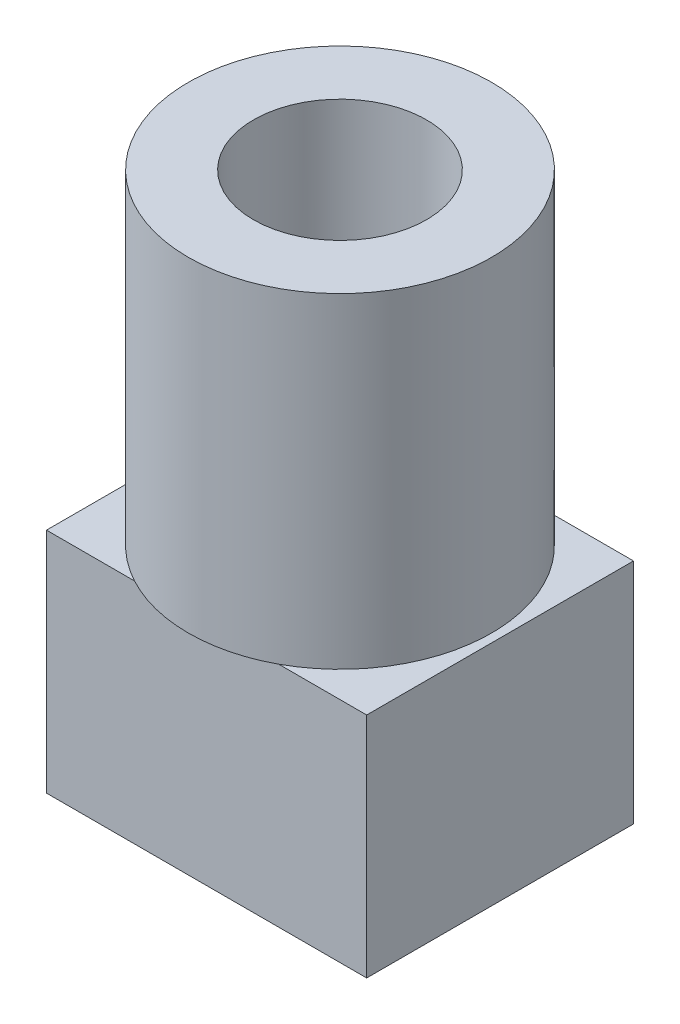
ISO-10303-21;
HEADER;
FILE_DESCRIPTION(('STEP AP214'),'2;1');
FILE_NAME('part.step','',(''),(''),'','','');
FILE_SCHEMA(('AUTOMOTIVE_DESIGN { 1 0 10303 214 1 1 1 1 }'));
ENDSEC;
DATA;
#1=APPLICATION_CONTEXT('core data for automotive mechanical design processes');
#2=APPLICATION_PROTOCOL_DEFINITION('international standard','automotive_design',2000,#1);
#3=PRODUCT_CONTEXT('',#1,'mechanical');
#4=PRODUCT('Part','Part','',(#3));
#5=PRODUCT_RELATED_PRODUCT_CATEGORY('part','',(#4));
#6=PRODUCT_DEFINITION_FORMATION('','',#4);
#7=PRODUCT_DEFINITION_CONTEXT('part definition',#1,'design');
#8=PRODUCT_DEFINITION('design','',#6,#7);
#9=PRODUCT_DEFINITION_SHAPE('','',#8);
#10=(LENGTH_UNIT() NAMED_UNIT(*) SI_UNIT(.MILLI.,.METRE.));
#11=(NAMED_UNIT(*) PLANE_ANGLE_UNIT() SI_UNIT($,.RADIAN.));
#12=(NAMED_UNIT(*) SI_UNIT($,.STERADIAN.) SOLID_ANGLE_UNIT());
#13=UNCERTAINTY_MEASURE_WITH_UNIT(LENGTH_MEASURE(1.E-05),#10,'distance_accuracy_value','');
#14=(GEOMETRIC_REPRESENTATION_CONTEXT(3) GLOBAL_UNCERTAINTY_ASSIGNED_CONTEXT((#13)) GLOBAL_UNIT_ASSIGNED_CONTEXT((#10,
#11,#12)) REPRESENTATION_CONTEXT('',''));
#15=CARTESIAN_POINT('',(0.,0.,0.));
#16=DIRECTION('',(0.,0.,1.));
#17=DIRECTION('',(1.,0.,0.));
#18=AXIS2_PLACEMENT_3D('',#15,#16,#17);
#19=CARTESIAN_POINT('',(4.92,7.,-4.1));
#20=DIRECTION('',(0.,1.,0.));
#21=DIRECTION('',(0.,0.,1.));
#22=AXIS2_PLACEMENT_3D('',#19,#20,#21);
#23=PLANE('',#22);
#24=DIRECTION('',(1.,0.,0.));
#25=VECTOR('',#24,1.);
#26=CARTESIAN_POINT('',(2.,7.,-2.));
#27=LINE('',#26,#25);
#28=CARTESIAN_POINT('',(6.55266653055669,7.,-2.));
#29=VERTEX_POINT('',#28);
#30=CARTESIAN_POINT('',(7.84,7.,-2.));
#31=VERTEX_POINT('',#30);
#32=EDGE_CURVE('E147',#29,#31,#27,.T.);
#33=ORIENTED_EDGE('',*,*,#32,.F.);
#34=CARTESIAN_POINT('',(4.92,7.,-4.1));
#35=DIRECTION('',(0.,1.,0.));
#36=DIRECTION('',(0.,0.,1.));
#37=AXIS2_PLACEMENT_3D('',#34,#35,#36);
#38=CIRCLE('',#37,2.66);
#39=CARTESIAN_POINT('',(6.55266653055669,7.,-6.2));
#40=VERTEX_POINT('',#39);
#41=EDGE_CURVE('E137',#29,#40,#38,.T.);
#42=ORIENTED_EDGE('',*,*,#41,.T.);
#43=DIRECTION('',(-1.,0.,0.));
#44=VECTOR('',#43,1.);
#45=CARTESIAN_POINT('',(2.,7.,-6.2));
#46=LINE('',#45,#44);
#47=CARTESIAN_POINT('',(7.84,7.,-6.2));
#48=VERTEX_POINT('',#47);
#49=EDGE_CURVE('E170',#48,#40,#46,.T.);
#50=ORIENTED_EDGE('',*,*,#49,.F.);
#51=DIRECTION('',(0.,0.,-1.));
#52=VECTOR('',#51,1.);
#53=CARTESIAN_POINT('',(7.84,7.,-6.2));
#54=LINE('',#53,#52);
#55=EDGE_CURVE('E155',#31,#48,#54,.T.);
#56=ORIENTED_EDGE('',*,*,#55,.F.);
#57=EDGE_LOOP('',(#33,#42,#50,#56));
#58=FACE_BOUND('',#57,.T.);
#59=ADVANCED_FACE('F43',(#58),#23,.F.);
#60=CARTESIAN_POINT('',(0.,7.,0.));
#61=DIRECTION('',(0.,-1.,0.));
#62=DIRECTION('',(0.,0.,-1.));
#63=AXIS2_PLACEMENT_3D('',#60,#61,#62);
#64=PLANE('',#63);
#65=CARTESIAN_POINT('',(4.92,7.,-4.1));
#66=DIRECTION('',(0.,1.,0.));
#67=DIRECTION('',(0.,0.,1.));
#68=AXIS2_PLACEMENT_3D('',#65,#66,#67);
#69=CIRCLE('',#68,4.66);
#70=CARTESIAN_POINT('',(7.13485891198514,7.,0.));
#71=VERTEX_POINT('',#70);
#72=CARTESIAN_POINT('',(7.13485891198514,7.,-8.2));
#73=VERTEX_POINT('',#72);
#74=EDGE_CURVE('E52',#71,#73,#69,.T.);
#75=ORIENTED_EDGE('',*,*,#74,.F.);
#76=DIRECTION('',(1.,0.,0.));
#77=VECTOR('',#76,1.);
#78=CARTESIAN_POINT('',(0.,7.,0.));
#79=LINE('',#78,#77);
#80=CARTESIAN_POINT('',(9.84,7.,0.));
#81=VERTEX_POINT('',#80);
#82=EDGE_CURVE('E187',#71,#81,#79,.T.);
#83=ORIENTED_EDGE('',*,*,#82,.T.);
#84=DIRECTION('',(0.,0.,-1.));
#85=VECTOR('',#84,1.);
#86=CARTESIAN_POINT('',(9.84,7.,0.));
#87=LINE('',#86,#85);
#88=CARTESIAN_POINT('',(9.84,7.,-8.2));
#89=VERTEX_POINT('',#88);
#90=EDGE_CURVE('E186',#81,#89,#87,.T.);
#91=ORIENTED_EDGE('',*,*,#90,.T.);
#92=DIRECTION('',(-1.,0.,0.));
#93=VECTOR('',#92,1.);
#94=CARTESIAN_POINT('',(0.,7.,-8.2));
#95=LINE('',#94,#93);
#96=EDGE_CURVE('E195',#89,#73,#95,.T.);
#97=ORIENTED_EDGE('',*,*,#96,.T.);
#98=EDGE_LOOP('',(#75,#83,#91,#97));
#99=FACE_BOUND('',#98,.T.);
#100=ADVANCED_FACE('F237',(#99),#64,.F.);
#101=CARTESIAN_POINT('',(0.,7.,0.));
#102=DIRECTION('',(1.,0.,0.));
#103=DIRECTION('',(0.,0.,-1.));
#104=AXIS2_PLACEMENT_3D('',#101,#102,#103);
#105=PLANE('',#104);
#106=DIRECTION('',(0.,0.,1.));
#107=VECTOR('',#106,1.);
#108=CARTESIAN_POINT('',(0.,0.,0.));
#109=LINE('',#108,#107);
#110=CARTESIAN_POINT('',(0.,0.,-8.2));
#111=VERTEX_POINT('',#110);
#112=CARTESIAN_POINT('',(0.,0.,0.));
#113=VERTEX_POINT('',#112);
#114=EDGE_CURVE('E174',#111,#113,#109,.T.);
#115=ORIENTED_EDGE('',*,*,#114,.T.);
#116=DIRECTION('',(0.,-1.,0.));
#117=VECTOR('',#116,1.);
#118=CARTESIAN_POINT('',(0.,7.,0.));
#119=LINE('',#118,#117);
#120=CARTESIAN_POINT('',(0.,7.,0.));
#121=VERTEX_POINT('',#120);
#122=EDGE_CURVE('E50',#121,#113,#119,.T.);
#123=ORIENTED_EDGE('',*,*,#122,.F.);
#124=DIRECTION('',(0.,0.,1.));
#125=VECTOR('',#124,1.);
#126=CARTESIAN_POINT('',(0.,7.,0.));
#127=LINE('',#126,#125);
#128=CARTESIAN_POINT('',(0.,7.,-8.2));
#129=VERTEX_POINT('',#128);
#130=EDGE_CURVE('E181',#129,#121,#127,.T.);
#131=ORIENTED_EDGE('',*,*,#130,.F.);
#132=DIRECTION('',(0.,-1.,0.));
#133=VECTOR('',#132,1.);
#134=CARTESIAN_POINT('',(0.,7.,-8.2));
#135=LINE('',#134,#133);
#136=EDGE_CURVE('E197',#129,#111,#135,.T.);
#137=ORIENTED_EDGE('',*,*,#136,.T.);
#138=EDGE_LOOP('',(#115,#123,#131,#137));
#139=FACE_BOUND('',#138,.T.);
#140=ADVANCED_FACE('F44',(#139),#105,.F.);
#141=CARTESIAN_POINT('',(0.,7.,0.));
#142=DIRECTION('',(0.,0.,-1.));
#143=DIRECTION('',(-1.,0.,0.));
#144=AXIS2_PLACEMENT_3D('',#141,#142,#143);
#145=PLANE('',#144);
#146=DIRECTION('',(1.,0.,0.));
#147=VECTOR('',#146,1.);
#148=CARTESIAN_POINT('',(0.,0.,0.));
#149=LINE('',#148,#147);
#150=CARTESIAN_POINT('',(9.84,0.,0.));
#151=VERTEX_POINT('',#150);
#152=EDGE_CURVE('E203',#113,#151,#149,.T.);
#153=ORIENTED_EDGE('',*,*,#152,.T.);
#154=DIRECTION('',(0.,-1.,0.));
#155=VECTOR('',#154,1.);
#156=CARTESIAN_POINT('',(9.84,7.,0.));
#157=LINE('',#156,#155);
#158=EDGE_CURVE('E209',#81,#151,#157,.T.);
#159=ORIENTED_EDGE('',*,*,#158,.F.);
#160=ORIENTED_EDGE('',*,*,#82,.F.);
#161=CARTESIAN_POINT('',(2.70514108801486,7.,0.));
#162=VERTEX_POINT('',#161);
#163=EDGE_CURVE('E193',#162,#71,#79,.T.);
#164=ORIENTED_EDGE('',*,*,#163,.F.);
#165=EDGE_CURVE('E188',#121,#162,#79,.T.);
#166=ORIENTED_EDGE('',*,*,#165,.F.);
#167=ORIENTED_EDGE('',*,*,#122,.T.);
#168=EDGE_LOOP('',(#153,#159,#160,#164,#166,#167));
#169=FACE_BOUND('',#168,.T.);
#170=ADVANCED_FACE('F218',(#169),#145,.F.);
#171=CARTESIAN_POINT('',(9.84,7.,0.));
#172=DIRECTION('',(-1.,0.,0.));
#173=DIRECTION('',(0.,0.,1.));
#174=AXIS2_PLACEMENT_3D('',#171,#172,#173);
#175=PLANE('',#174);
#176=DIRECTION('',(0.,0.,-1.));
#177=VECTOR('',#176,1.);
#178=CARTESIAN_POINT('',(9.84,0.,0.));
#179=LINE('',#178,#177);
#180=CARTESIAN_POINT('',(9.84,0.,-8.2));
#181=VERTEX_POINT('',#180);
#182=EDGE_CURVE('E201',#151,#181,#179,.T.);
#183=ORIENTED_EDGE('',*,*,#182,.T.);
#184=DIRECTION('',(0.,-1.,0.));
#185=VECTOR('',#184,1.);
#186=CARTESIAN_POINT('',(9.84,7.,-8.2));
#187=LINE('',#186,#185);
#188=EDGE_CURVE('E208',#89,#181,#187,.T.);
#189=ORIENTED_EDGE('',*,*,#188,.F.);
#190=ORIENTED_EDGE('',*,*,#90,.F.);
#191=ORIENTED_EDGE('',*,*,#158,.T.);
#192=EDGE_LOOP('',(#183,#189,#190,#191));
#193=FACE_BOUND('',#192,.T.);
#194=ADVANCED_FACE('F229',(#193),#175,.F.);
#195=CARTESIAN_POINT('',(0.,7.,-8.2));
#196=DIRECTION('',(0.,0.,1.));
#197=DIRECTION('',(1.,0.,0.));
#198=AXIS2_PLACEMENT_3D('',#195,#196,#197);
#199=PLANE('',#198);
#200=DIRECTION('',(-1.,0.,0.));
#201=VECTOR('',#200,1.);
#202=CARTESIAN_POINT('',(0.,0.,-8.2));
#203=LINE('',#202,#201);
#204=EDGE_CURVE('E190',#181,#111,#203,.T.);
#205=ORIENTED_EDGE('',*,*,#204,.T.);
#206=ORIENTED_EDGE('',*,*,#136,.F.);
#207=CARTESIAN_POINT('',(2.70514108801486,7.,-8.2));
#208=VERTEX_POINT('',#207);
#209=EDGE_CURVE('E192',#208,#129,#95,.T.);
#210=ORIENTED_EDGE('',*,*,#209,.F.);
#211=EDGE_CURVE('E196',#73,#208,#95,.T.);
#212=ORIENTED_EDGE('',*,*,#211,.F.);
#213=ORIENTED_EDGE('',*,*,#96,.F.);
#214=ORIENTED_EDGE('',*,*,#188,.T.);
#215=EDGE_LOOP('',(#205,#206,#210,#212,#213,#214));
#216=FACE_BOUND('',#215,.T.);
#217=ADVANCED_FACE('F234',(#216),#199,.F.);
#218=EDGE_CURVE('E11',#208,#162,#69,.T.);
#219=ORIENTED_EDGE('',*,*,#218,.F.);
#220=ORIENTED_EDGE('',*,*,#209,.T.);
#221=ORIENTED_EDGE('',*,*,#130,.T.);
#222=ORIENTED_EDGE('',*,*,#165,.T.);
#223=EDGE_LOOP('',(#219,#220,#221,#222));
#224=FACE_BOUND('',#223,.T.);
#225=ADVANCED_FACE('F291',(#224),#64,.F.);
#226=CARTESIAN_POINT('',(0.,0.,0.));
#227=DIRECTION('',(0.,-1.,0.));
#228=DIRECTION('',(0.,0.,-1.));
#229=AXIS2_PLACEMENT_3D('',#226,#227,#228);
#230=PLANE('',#229);
#231=DIRECTION('',(0.,0.,1.));
#232=VECTOR('',#231,1.);
#233=CARTESIAN_POINT('',(2.,0.,-6.2));
#234=LINE('',#233,#232);
#235=CARTESIAN_POINT('',(2.,0.,-6.2));
#236=VERTEX_POINT('',#235);
#237=CARTESIAN_POINT('',(2.,0.,-2.));
#238=VERTEX_POINT('',#237);
#239=EDGE_CURVE('E166',#236,#238,#234,.T.);
#240=ORIENTED_EDGE('',*,*,#239,.T.);
#241=DIRECTION('',(1.,0.,0.));
#242=VECTOR('',#241,1.);
#243=CARTESIAN_POINT('',(2.,0.,-2.));
#244=LINE('',#243,#242);
#245=CARTESIAN_POINT('',(7.84,0.,-2.));
#246=VERTEX_POINT('',#245);
#247=EDGE_CURVE('E251',#238,#246,#244,.T.);
#248=ORIENTED_EDGE('',*,*,#247,.T.);
#249=DIRECTION('',(0.,0.,-1.));
#250=VECTOR('',#249,1.);
#251=CARTESIAN_POINT('',(7.84,0.,-6.2));
#252=LINE('',#251,#250);
#253=CARTESIAN_POINT('',(7.84,0.,-6.2));
#254=VERTEX_POINT('',#253);
#255=EDGE_CURVE('E258',#246,#254,#252,.T.);
#256=ORIENTED_EDGE('',*,*,#255,.T.);
#257=DIRECTION('',(-1.,0.,0.));
#258=VECTOR('',#257,1.);
#259=CARTESIAN_POINT('',(2.,0.,-6.2));
#260=LINE('',#259,#258);
#261=EDGE_CURVE('E185',#254,#236,#260,.T.);
#262=ORIENTED_EDGE('',*,*,#261,.T.);
#263=EDGE_LOOP('',(#240,#248,#256,#262));
#264=FACE_BOUND('',#263,.T.);
#265=ORIENTED_EDGE('',*,*,#114,.F.);
#266=ORIENTED_EDGE('',*,*,#204,.F.);
#267=ORIENTED_EDGE('',*,*,#182,.F.);
#268=ORIENTED_EDGE('',*,*,#152,.F.);
#269=EDGE_LOOP('',(#265,#266,#267,#268));
#270=FACE_BOUND('',#269,.T.);
#271=ADVANCED_FACE('F230',(#264,#270),#230,.T.);
#272=CARTESIAN_POINT('',(2.,0.,-6.2));
#273=DIRECTION('',(-1.,0.,0.));
#274=DIRECTION('',(0.,0.,1.));
#275=AXIS2_PLACEMENT_3D('',#272,#273,#274);
#276=PLANE('',#275);
#277=DIRECTION('',(0.,0.,1.));
#278=VECTOR('',#277,1.);
#279=CARTESIAN_POINT('',(2.,7.,-6.2));
#280=LINE('',#279,#278);
#281=CARTESIAN_POINT('',(2.,7.,-6.2));
#282=VERTEX_POINT('',#281);
#283=CARTESIAN_POINT('',(2.,7.,-2.));
#284=VERTEX_POINT('',#283);
#285=EDGE_CURVE('E156',#282,#284,#280,.T.);
#286=ORIENTED_EDGE('',*,*,#285,.T.);
#287=DIRECTION('',(0.,1.,0.));
#288=VECTOR('',#287,1.);
#289=CARTESIAN_POINT('',(2.,0.,-2.));
#290=LINE('',#289,#288);
#291=EDGE_CURVE('E176',#238,#284,#290,.T.);
#292=ORIENTED_EDGE('',*,*,#291,.F.);
#293=ORIENTED_EDGE('',*,*,#239,.F.);
#294=DIRECTION('',(0.,1.,0.));
#295=VECTOR('',#294,1.);
#296=CARTESIAN_POINT('',(2.,0.,-6.2));
#297=LINE('',#296,#295);
#298=EDGE_CURVE('E172',#236,#282,#297,.T.);
#299=ORIENTED_EDGE('',*,*,#298,.T.);
#300=EDGE_LOOP('',(#286,#292,#293,#299));
#301=FACE_BOUND('',#300,.T.);
#302=ADVANCED_FACE('F267',(#301),#276,.F.);
#303=CARTESIAN_POINT('',(2.,0.,-6.2));
#304=DIRECTION('',(0.,0.,-1.));
#305=DIRECTION('',(-1.,0.,0.));
#306=AXIS2_PLACEMENT_3D('',#303,#304,#305);
#307=PLANE('',#306);
#308=ORIENTED_EDGE('',*,*,#49,.T.);
#309=CARTESIAN_POINT('',(3.28733346944332,7.,-6.2));
#310=VERTEX_POINT('',#309);
#311=EDGE_CURVE('E168',#40,#310,#46,.T.);
#312=ORIENTED_EDGE('',*,*,#311,.T.);
#313=EDGE_CURVE('E167',#310,#282,#46,.T.);
#314=ORIENTED_EDGE('',*,*,#313,.T.);
#315=ORIENTED_EDGE('',*,*,#298,.F.);
#316=ORIENTED_EDGE('',*,*,#261,.F.);
#317=DIRECTION('',(0.,1.,0.));
#318=VECTOR('',#317,1.);
#319=CARTESIAN_POINT('',(7.84,0.,-6.2));
#320=LINE('',#319,#318);
#321=EDGE_CURVE('E171',#254,#48,#320,.T.);
#322=ORIENTED_EDGE('',*,*,#321,.T.);
#323=EDGE_LOOP('',(#308,#312,#314,#315,#316,#322));
#324=FACE_BOUND('',#323,.T.);
#325=ADVANCED_FACE('F263',(#324),#307,.F.);
#326=CARTESIAN_POINT('',(7.84,0.,-6.2));
#327=DIRECTION('',(1.,0.,0.));
#328=DIRECTION('',(0.,0.,-1.));
#329=AXIS2_PLACEMENT_3D('',#326,#327,#328);
#330=PLANE('',#329);
#331=ORIENTED_EDGE('',*,*,#55,.T.);
#332=ORIENTED_EDGE('',*,*,#321,.F.);
#333=ORIENTED_EDGE('',*,*,#255,.F.);
#334=DIRECTION('',(0.,1.,0.));
#335=VECTOR('',#334,1.);
#336=CARTESIAN_POINT('',(7.84,0.,-2.));
#337=LINE('',#336,#335);
#338=EDGE_CURVE('E177',#246,#31,#337,.T.);
#339=ORIENTED_EDGE('',*,*,#338,.T.);
#340=EDGE_LOOP('',(#331,#332,#333,#339));
#341=FACE_BOUND('',#340,.T.);
#342=ADVANCED_FACE('F275',(#341),#330,.F.);
#343=CARTESIAN_POINT('',(2.,0.,-2.));
#344=DIRECTION('',(0.,0.,1.));
#345=DIRECTION('',(1.,0.,0.));
#346=AXIS2_PLACEMENT_3D('',#343,#344,#345);
#347=PLANE('',#346);
#348=CARTESIAN_POINT('',(3.28733346944332,7.,-2.));
#349=VERTEX_POINT('',#348);
#350=EDGE_CURVE('E158',#284,#349,#27,.T.);
#351=ORIENTED_EDGE('',*,*,#350,.T.);
#352=EDGE_CURVE('E133',#349,#29,#27,.T.);
#353=ORIENTED_EDGE('',*,*,#352,.T.);
#354=ORIENTED_EDGE('',*,*,#32,.T.);
#355=ORIENTED_EDGE('',*,*,#338,.F.);
#356=ORIENTED_EDGE('',*,*,#247,.F.);
#357=ORIENTED_EDGE('',*,*,#291,.T.);
#358=EDGE_LOOP('',(#351,#353,#354,#355,#356,#357));
#359=FACE_BOUND('',#358,.T.);
#360=ADVANCED_FACE('F159',(#359),#347,.F.);
#361=CARTESIAN_POINT('',(4.92,17.,-4.1));
#362=DIRECTION('',(0.,1.,0.));
#363=DIRECTION('',(0.,0.,1.));
#364=AXIS2_PLACEMENT_3D('',#361,#362,#363);
#365=PLANE('',#364);
#366=CARTESIAN_POINT('',(4.92,17.,-4.1));
#367=DIRECTION('',(0.,1.,0.));
#368=DIRECTION('',(0.,0.,1.));
#369=AXIS2_PLACEMENT_3D('',#366,#367,#368);
#370=CIRCLE('',#369,2.66);
#371=CARTESIAN_POINT('',(4.92,17.,-1.44));
#372=VERTEX_POINT('',#371);
#373=EDGE_CURVE('E138',#372,#372,#370,.T.);
#374=ORIENTED_EDGE('',*,*,#373,.F.);
#375=EDGE_LOOP('',(#374));
#376=FACE_BOUND('',#375,.T.);
#377=CARTESIAN_POINT('',(4.92,17.,-4.1));
#378=DIRECTION('',(0.,1.,0.));
#379=DIRECTION('',(0.,0.,1.));
#380=AXIS2_PLACEMENT_3D('',#377,#378,#379);
#381=CIRCLE('',#380,4.66);
#382=CARTESIAN_POINT('',(4.92,17.,0.560000000000001));
#383=VERTEX_POINT('',#382);
#384=EDGE_CURVE('E248',#383,#383,#381,.T.);
#385=ORIENTED_EDGE('',*,*,#384,.T.);
#386=EDGE_LOOP('',(#385));
#387=FACE_BOUND('',#386,.T.);
#388=ADVANCED_FACE('F278',(#376,#387),#365,.T.);
#389=CARTESIAN_POINT('',(4.92,17.,-4.1));
#390=DIRECTION('',(0.,-1.,0.));
#391=DIRECTION('',(0.,0.,-1.));
#392=AXIS2_PLACEMENT_3D('',#389,#390,#391);
#393=CYLINDRICAL_SURFACE('',#392,4.66);
#394=ORIENTED_EDGE('',*,*,#384,.F.);
#395=EDGE_LOOP('',(#394));
#396=FACE_BOUND('',#395,.T.);
#397=ORIENTED_EDGE('',*,*,#74,.T.);
#398=EDGE_CURVE('E53',#73,#208,#69,.T.);
#399=ORIENTED_EDGE('',*,*,#398,.T.);
#400=ORIENTED_EDGE('',*,*,#218,.T.);
#401=EDGE_CURVE('E146',#162,#71,#69,.T.);
#402=ORIENTED_EDGE('',*,*,#401,.T.);
#403=EDGE_LOOP('',(#397,#399,#400,#402));
#404=FACE_BOUND('',#403,.T.);
#405=ADVANCED_FACE('F244',(#396,#404),#393,.T.);
#406=ORIENTED_EDGE('',*,*,#398,.F.);
#407=ORIENTED_EDGE('',*,*,#211,.T.);
#408=EDGE_LOOP('',(#406,#407));
#409=FACE_BOUND('',#408,.T.);
#410=ADVANCED_FACE('F242',(#409),#23,.F.);
#411=ORIENTED_EDGE('',*,*,#401,.F.);
#412=ORIENTED_EDGE('',*,*,#163,.T.);
#413=EDGE_LOOP('',(#411,#412));
#414=FACE_BOUND('',#413,.T.);
#415=ADVANCED_FACE('F288',(#414),#23,.F.);
#416=ORIENTED_EDGE('',*,*,#313,.F.);
#417=EDGE_CURVE('E131',#310,#349,#38,.T.);
#418=ORIENTED_EDGE('',*,*,#417,.T.);
#419=ORIENTED_EDGE('',*,*,#350,.F.);
#420=ORIENTED_EDGE('',*,*,#285,.F.);
#421=EDGE_LOOP('',(#416,#418,#419,#420));
#422=FACE_BOUND('',#421,.T.);
#423=ADVANCED_FACE('F289',(#422),#23,.F.);
#424=CARTESIAN_POINT('',(4.92,7.,-4.1));
#425=DIRECTION('',(0.,1.,0.));
#426=DIRECTION('',(0.,0.,1.));
#427=AXIS2_PLACEMENT_3D('',#424,#425,#426);
#428=PLANE('',#427);
#429=EDGE_CURVE('E62',#349,#29,#38,.T.);
#430=ORIENTED_EDGE('',*,*,#429,.T.);
#431=ORIENTED_EDGE('',*,*,#352,.F.);
#432=EDGE_LOOP('',(#430,#431));
#433=FACE_BOUND('',#432,.T.);
#434=ADVANCED_FACE('F132',(#433),#428,.T.);
#435=CARTESIAN_POINT('',(4.92,7.,-4.1));
#436=DIRECTION('',(0.,1.,0.));
#437=DIRECTION('',(0.,0.,1.));
#438=AXIS2_PLACEMENT_3D('',#435,#436,#437);
#439=CYLINDRICAL_SURFACE('',#438,2.66);
#440=ORIENTED_EDGE('',*,*,#41,.F.);
#441=ORIENTED_EDGE('',*,*,#429,.F.);
#442=ORIENTED_EDGE('',*,*,#417,.F.);
#443=EDGE_CURVE('E144',#40,#310,#38,.T.);
#444=ORIENTED_EDGE('',*,*,#443,.F.);
#445=EDGE_LOOP('',(#440,#441,#442,#444));
#446=FACE_BOUND('',#445,.T.);
#447=ORIENTED_EDGE('',*,*,#373,.T.);
#448=EDGE_LOOP('',(#447));
#449=FACE_BOUND('',#448,.T.);
#450=ADVANCED_FACE('F142',(#446,#449),#439,.F.);
#451=ORIENTED_EDGE('',*,*,#443,.T.);
#452=ORIENTED_EDGE('',*,*,#311,.F.);
#453=EDGE_LOOP('',(#451,#452));
#454=FACE_BOUND('',#453,.T.);
#455=ADVANCED_FACE('F305',(#454),#428,.T.);
#456=CLOSED_SHELL('',(#59,#100,#140,#170,#194,#217,#225,#271,#302,#325,#342,#360,#388,#405,#410,
#415,#423,#434,#450,#455));
#457=MANIFOLD_SOLID_BREP('B2',#456);
#458=ADVANCED_BREP_SHAPE_REPRESENTATION('',(#18,#457),#14);
#459=SHAPE_DEFINITION_REPRESENTATION(#9,#458);
ENDSEC;
END-ISO-10303-21;
